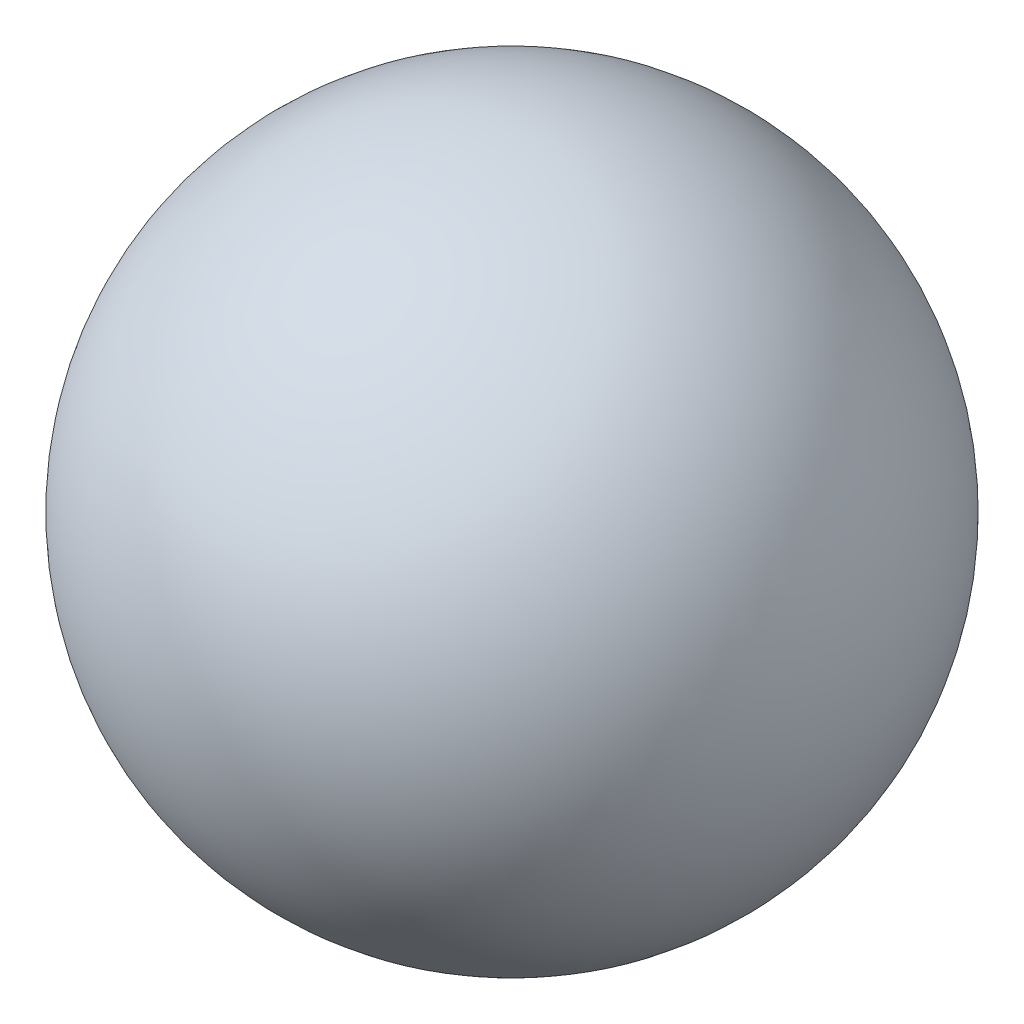
ISO-10303-21;
HEADER;
FILE_DESCRIPTION(('STEP AP214'),'2;1');
FILE_NAME('part.step','',(''),(''),'','','');
FILE_SCHEMA(('AUTOMOTIVE_DESIGN { 1 0 10303 214 1 1 1 1 }'));
ENDSEC;
DATA;
#1=APPLICATION_CONTEXT('core data for automotive mechanical design processes');
#2=APPLICATION_PROTOCOL_DEFINITION('international standard','automotive_design',2000,#1);
#3=PRODUCT_CONTEXT('',#1,'mechanical');
#4=PRODUCT('Part','Part','',(#3));
#5=PRODUCT_RELATED_PRODUCT_CATEGORY('part','',(#4));
#6=PRODUCT_DEFINITION_FORMATION('','',#4);
#7=PRODUCT_DEFINITION_CONTEXT('part definition',#1,'design');
#8=PRODUCT_DEFINITION('design','',#6,#7);
#9=PRODUCT_DEFINITION_SHAPE('','',#8);
#10=(LENGTH_UNIT() NAMED_UNIT(*) SI_UNIT(.MILLI.,.METRE.));
#11=(NAMED_UNIT(*) PLANE_ANGLE_UNIT() SI_UNIT($,.RADIAN.));
#12=(NAMED_UNIT(*) SI_UNIT($,.STERADIAN.) SOLID_ANGLE_UNIT());
#13=UNCERTAINTY_MEASURE_WITH_UNIT(LENGTH_MEASURE(1.E-05),#10,'distance_accuracy_value','');
#14=(GEOMETRIC_REPRESENTATION_CONTEXT(3) GLOBAL_UNCERTAINTY_ASSIGNED_CONTEXT((#13)) GLOBAL_UNIT_ASSIGNED_CONTEXT((#10,
#11,#12)) REPRESENTATION_CONTEXT('',''));
#15=CARTESIAN_POINT('',(0.,0.,0.));
#16=DIRECTION('',(0.,0.,1.));
#17=DIRECTION('',(1.,0.,0.));
#18=AXIS2_PLACEMENT_3D('',#15,#16,#17);
#19=CARTESIAN_POINT('',(0.,0.,0.));
#20=DIRECTION('',(0.,-1.,0.));
#21=DIRECTION('',(-1.,0.,0.));
#22=AXIS2_PLACEMENT_3D('',#19,#20,#21);
#23=SPHERICAL_SURFACE('',#22,20.);
#24=CARTESIAN_POINT('',(0.,-20.,0.));
#25=VERTEX_POINT('',#24);
#26=VERTEX_LOOP('',#25);
#27=FACE_BOUND('',#26,.T.);
#28=ADVANCED_FACE('F34',(#27),#23,.T.);
#29=CLOSED_SHELL('',(#28));
#30=CARTESIAN_POINT('',(0.,0.,0.));
#31=DIRECTION('',(0.,-1.,0.));
#32=DIRECTION('',(1.,0.,0.));
#33=AXIS2_PLACEMENT_3D('',#30,#31,#32);
#34=SPHERICAL_SURFACE('',#33,18.);
#35=CARTESIAN_POINT('',(0.,-18.,0.));
#36=VERTEX_POINT('',#35);
#37=VERTEX_LOOP('',#36);
#38=FACE_BOUND('',#37,.T.);
#39=ADVANCED_FACE('F47',(#38),#34,.F.);
#40=CLOSED_SHELL('',(#39));
#41=ORIENTED_CLOSED_SHELL('',*,#40,.T.);
#42=BREP_WITH_VOIDS('B2',#29,(#41));
#43=ADVANCED_BREP_SHAPE_REPRESENTATION('',(#18,#42),#14);
#44=SHAPE_DEFINITION_REPRESENTATION(#9,#43);
ENDSEC;
END-ISO-10303-21;
